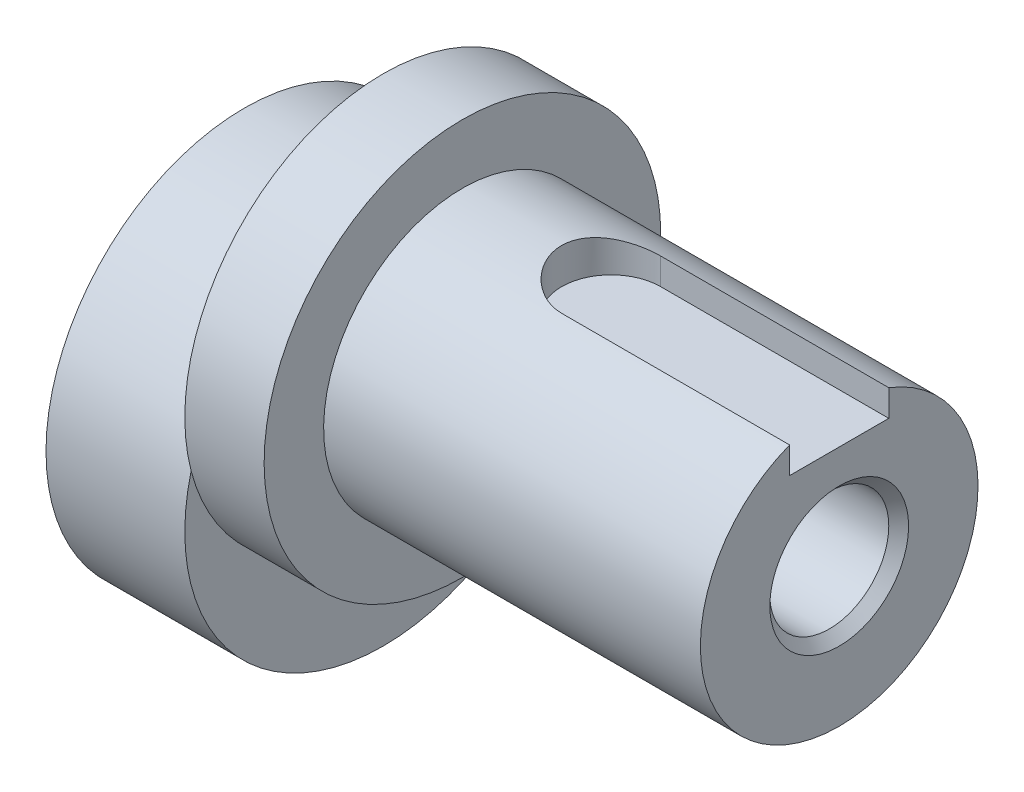
ISO-10303-21;
HEADER;
FILE_DESCRIPTION(('STEP AP214'),'2;1');
FILE_NAME('part.step','',(''),(''),'','','');
FILE_SCHEMA(('AUTOMOTIVE_DESIGN { 1 0 10303 214 1 1 1 1 }'));
ENDSEC;
DATA;
#1=APPLICATION_CONTEXT('core data for automotive mechanical design processes');
#2=APPLICATION_PROTOCOL_DEFINITION('international standard','automotive_design',2000,#1);
#3=PRODUCT_CONTEXT('',#1,'mechanical');
#4=PRODUCT('Part','Part','',(#3));
#5=PRODUCT_RELATED_PRODUCT_CATEGORY('part','',(#4));
#6=PRODUCT_DEFINITION_FORMATION('','',#4);
#7=PRODUCT_DEFINITION_CONTEXT('part definition',#1,'design');
#8=PRODUCT_DEFINITION('design','',#6,#7);
#9=PRODUCT_DEFINITION_SHAPE('','',#8);
#10=(LENGTH_UNIT() NAMED_UNIT(*) SI_UNIT(.MILLI.,.METRE.));
#11=(NAMED_UNIT(*) PLANE_ANGLE_UNIT() SI_UNIT($,.RADIAN.));
#12=(NAMED_UNIT(*) SI_UNIT($,.STERADIAN.) SOLID_ANGLE_UNIT());
#13=UNCERTAINTY_MEASURE_WITH_UNIT(LENGTH_MEASURE(1.E-05),#10,'distance_accuracy_value','');
#14=(GEOMETRIC_REPRESENTATION_CONTEXT(3) GLOBAL_UNCERTAINTY_ASSIGNED_CONTEXT((#13)) GLOBAL_UNIT_ASSIGNED_CONTEXT((#10,
#11,#12)) REPRESENTATION_CONTEXT('',''));
#15=CARTESIAN_POINT('',(0.,0.,0.));
#16=DIRECTION('',(0.,0.,1.));
#17=DIRECTION('',(1.,0.,0.));
#18=AXIS2_PLACEMENT_3D('',#15,#16,#17);
#19=CARTESIAN_POINT('',(30.,5.,0.));
#20=DIRECTION('',(-1.,0.,0.));
#21=DIRECTION('',(0.,0.,1.));
#22=AXIS2_PLACEMENT_3D('',#19,#20,#21);
#23=CYLINDRICAL_SURFACE('',#22,7.);
#24=CARTESIAN_POINT('',(11.,5.,0.));
#25=DIRECTION('',(1.,0.,0.));
#26=DIRECTION('',(0.,0.,-1.));
#27=AXIS2_PLACEMENT_3D('',#24,#25,#26);
#28=CIRCLE('',#27,7.);
#29=CARTESIAN_POINT('',(11.,5.,-7.));
#30=VERTEX_POINT('',#29);
#31=EDGE_CURVE('E112',#30,#30,#28,.T.);
#32=ORIENTED_EDGE('',*,*,#31,.T.);
#33=EDGE_LOOP('',(#32));
#34=FACE_BOUND('',#33,.T.);
#35=DIRECTION('',(-1.,0.,0.));
#36=VECTOR('',#35,1.);
#37=CARTESIAN_POINT('',(30.,11.538348415311,-2.5));
#38=LINE('',#37,#36);
#39=CARTESIAN_POINT('',(30.,11.538348415311,-2.5));
#40=VERTEX_POINT('',#39);
#41=CARTESIAN_POINT('',(18.5,11.538348415311,-2.5));
#42=VERTEX_POINT('',#41);
#43=EDGE_CURVE('E92',#40,#42,#38,.T.);
#44=ORIENTED_EDGE('',*,*,#43,.F.);
#45=CARTESIAN_POINT('',(30.,5.,0.));
#46=DIRECTION('',(1.,0.,0.));
#47=DIRECTION('',(0.,0.,-1.));
#48=AXIS2_PLACEMENT_3D('',#45,#46,#47);
#49=CIRCLE('',#48,7.);
#50=CARTESIAN_POINT('',(30.,11.538348415311,2.5));
#51=VERTEX_POINT('',#50);
#52=EDGE_CURVE('E113',#51,#40,#49,.T.);
#53=ORIENTED_EDGE('',*,*,#52,.F.);
#54=DIRECTION('',(-1.,0.,0.));
#55=VECTOR('',#54,1.);
#56=CARTESIAN_POINT('',(30.,11.538348415311,2.5));
#57=LINE('',#56,#55);
#58=CARTESIAN_POINT('',(18.5,11.538348415311,2.5));
#59=VERTEX_POINT('',#58);
#60=EDGE_CURVE('E96',#59,#51,#57,.F.);
#61=ORIENTED_EDGE('',*,*,#60,.F.);
#62=CARTESIAN_POINT('',(18.5,11.538348415311,-2.5));
#63=CARTESIAN_POINT('',(18.4321107542711,11.5383365378513,-2.50000932220903));
#64=CARTESIAN_POINT('',(18.3642280673609,11.5394054992274,-2.49723485076694));
#65=CARTESIAN_POINT('',(18.2289960893886,11.5436165747813,-2.4861910211816));
#66=CARTESIAN_POINT('',(18.1616466413939,11.5467580541806,-2.47792334551208));
#67=CARTESIAN_POINT('',(18.0281785853972,11.5550121763794,-2.456001752859));
#68=CARTESIAN_POINT('',(17.9620566636602,11.5601183170568,-2.44236559963955));
#69=CARTESIAN_POINT('',(17.8312981648915,11.5721317785417,-2.40985115466648));
#70=CARTESIAN_POINT('',(17.7666616536876,11.5790391790075,-2.39097263107436));
#71=CARTESIAN_POINT('',(17.5757356335225,11.6021493436571,-2.32673964179204));
#72=CARTESIAN_POINT('',(17.4522095478644,11.6207547534084,-2.27375112606986));
#73=CARTESIAN_POINT('',(17.215769666872,11.6622539736071,-2.14910757865425));
#74=CARTESIAN_POINT('',(17.1028636832645,11.6851509042488,-2.07743895048849));
#75=CARTESIAN_POINT('',(16.8857847866473,11.7337991379222,-1.9140257110197));
#76=CARTESIAN_POINT('',(16.7821535248041,11.7596286404137,-1.82158337146744));
#77=CARTESIAN_POINT('',(16.5914912952836,11.8105759232303,-1.6207338877633));
#78=CARTESIAN_POINT('',(16.5044634207566,11.8356935701987,-1.51232377552673));
#79=CARTESIAN_POINT('',(16.346910144545,11.8833113327905,-1.27853915335934));
#80=CARTESIAN_POINT('',(16.2769684781395,11.905708352238,-1.15274833789185));
#81=CARTESIAN_POINT('',(16.1594633532026,11.9444235767263,-0.890250825476634));
#82=CARTESIAN_POINT('',(16.111892220954,11.9607438658547,-0.753547890540327));
#83=CARTESIAN_POINT('',(16.0423593978176,11.9849105051071,-0.478829979256175));
#84=CARTESIAN_POINT('',(16.0194608695289,11.9930659435251,-0.341079835227467));
#85=CARTESIAN_POINT('',(15.9969315972224,12.0010879805382,-0.0634643052969042));
#86=CARTESIAN_POINT('',(15.9972944139654,12.000956873027,0.0764004845074478));
#87=CARTESIAN_POINT('',(16.0207112737611,11.9926225804908,0.347593258486946));
#88=CARTESIAN_POINT('',(16.0427447941985,11.9847824358352,0.479022407078721));
#89=CARTESIAN_POINT('',(16.1071734241588,11.9623783250735,0.736175812143608));
#90=CARTESIAN_POINT('',(16.1495696843625,11.9478139789904,0.861899745780464));
#91=CARTESIAN_POINT('',(16.2540469115653,11.9131650689037,1.10616102429807));
#92=CARTESIAN_POINT('',(16.3163957149601,11.8930059216431,1.22457279066906));
#93=CARTESIAN_POINT('',(16.4587793352234,11.8492335561632,1.44953531305523));
#94=CARTESIAN_POINT('',(16.5388195237836,11.8256192895926,1.5560824517677));
#95=CARTESIAN_POINT('',(16.7193232636567,11.7759054780549,1.7603244525607));
#96=CARTESIAN_POINT('',(16.8206497231449,11.7497405584388,1.85724185700417));
#97=CARTESIAN_POINT('',(17.0383273641656,11.6989034246898,2.03299914621296));
#98=CARTESIAN_POINT('',(17.1546839051685,11.6742317476526,2.11183255456462));
#99=CARTESIAN_POINT('',(17.401942598522,11.628778038754,2.25049860898459));
#100=CARTESIAN_POINT('',(17.5330789755054,11.6080787511899,2.30994207989626));
#101=CARTESIAN_POINT('',(17.8043648015822,11.5738821361027,2.4055543972585));
#102=CARTESIAN_POINT('',(17.944499141169,11.5603730716505,2.44176119399954));
#103=CARTESIAN_POINT('',(18.1550305442642,11.5470854224556,2.47705497148627));
#104=CARTESIAN_POINT('',(18.2237363017718,11.5438201096791,2.48565347586445));
#105=CARTESIAN_POINT('',(18.3616151641917,11.5394491082968,2.49712352174882));
#106=CARTESIAN_POINT('',(18.4307876671005,11.5383410314094,2.50000139665367));
#107=CARTESIAN_POINT('',(18.5,11.538348415311,2.5));
#108=B_SPLINE_CURVE_WITH_KNOTS('',3,(#62,#63,#64,#65,#66,#67,#68,#69,#70,#71,#72,#73,#74,#75,
#76,#77,#78,#79,#80,#81,#82,#83,#84,#85,#86,#87,#88,#89,#90,#91,#92,#93,#94,#95,#96,#97,#98,#99,
#100,#101,#102,#103,#104,#105,#106,#107),.UNSPECIFIED.,.F.,.F.,(4,2,2,2,2,2,2,2,2,2,2,2,2,2,2,2,
2,2,2,2,2,2,4),(0.,0.203591628551585,0.407120929225524,0.609982356545741,0.812852756635989,
1.21793118555512,1.6233052814847,2.0451597231193,2.4670926781184,2.90188398965561,
3.33652604665238,3.75400993940861,4.17137826416922,4.56998920861347,4.96862268086888,
5.37284909448639,5.77719841367921,6.20315837945087,6.62927065674721,7.06347329058505,
7.49696496492444,7.70468580162773,7.91217653896403),.UNSPECIFIED.);
#109=EDGE_CURVE('E11',#42,#59,#108,.T.);
#110=ORIENTED_EDGE('',*,*,#109,.F.);
#111=EDGE_LOOP('',(#44,#53,#61,#110));
#112=FACE_BOUND('',#111,.T.);
#113=ADVANCED_FACE('F33',(#34,#112),#23,.T.);
#114=CARTESIAN_POINT('',(30.,5.,0.));
#115=DIRECTION('',(1.,0.,0.));
#116=DIRECTION('',(0.,0.,-1.));
#117=AXIS2_PLACEMENT_3D('',#114,#115,#116);
#118=PLANE('',#117);
#119=CARTESIAN_POINT('',(30.,5.,0.));
#120=DIRECTION('',(1.,0.,0.));
#121=DIRECTION('',(0.,0.,-1.));
#122=AXIS2_PLACEMENT_3D('',#119,#120,#121);
#123=CIRCLE('',#122,3.50000000000002);
#124=CARTESIAN_POINT('',(30.,5.,-3.50000000000002));
#125=VERTEX_POINT('',#124);
#126=EDGE_CURVE('E136',#125,#125,#123,.F.);
#127=ORIENTED_EDGE('',*,*,#126,.T.);
#128=EDGE_LOOP('',(#127));
#129=FACE_BOUND('',#128,.T.);
#130=ORIENTED_EDGE('',*,*,#52,.T.);
#131=DIRECTION('',(0.,-1.,0.));
#132=VECTOR('',#131,1.);
#133=CARTESIAN_POINT('',(30.,5.,-2.5));
#134=LINE('',#133,#132);
#135=CARTESIAN_POINT('',(30.,10.2,-2.5));
#136=VERTEX_POINT('',#135);
#137=EDGE_CURVE('E46',#40,#136,#134,.T.);
#138=ORIENTED_EDGE('',*,*,#137,.T.);
#139=DIRECTION('',(0.,0.,1.));
#140=VECTOR('',#139,1.);
#141=CARTESIAN_POINT('',(30.,10.2,0.));
#142=LINE('',#141,#140);
#143=CARTESIAN_POINT('',(30.,10.2,2.5));
#144=VERTEX_POINT('',#143);
#145=EDGE_CURVE('E102',#136,#144,#142,.T.);
#146=ORIENTED_EDGE('',*,*,#145,.T.);
#147=DIRECTION('',(0.,1.,0.));
#148=VECTOR('',#147,1.);
#149=CARTESIAN_POINT('',(30.,5.,2.5));
#150=LINE('',#149,#148);
#151=EDGE_CURVE('E143',#144,#51,#150,.T.);
#152=ORIENTED_EDGE('',*,*,#151,.T.);
#153=EDGE_LOOP('',(#130,#138,#146,#152));
#154=FACE_BOUND('',#153,.T.);
#155=ADVANCED_FACE('F146',(#129,#154),#118,.T.);
#156=CARTESIAN_POINT('',(7.,0.,0.));
#157=DIRECTION('',(-1.,0.,0.));
#158=DIRECTION('',(0.,0.,1.));
#159=AXIS2_PLACEMENT_3D('',#156,#157,#158);
#160=CYLINDRICAL_SURFACE('',#159,10.);
#161=CARTESIAN_POINT('',(7.,0.,0.));
#162=DIRECTION('',(1.,0.,0.));
#163=DIRECTION('',(0.,0.,-1.));
#164=AXIS2_PLACEMENT_3D('',#161,#162,#163);
#165=CIRCLE('',#164,10.);
#166=CARTESIAN_POINT('',(7.,2.49999999999999,-9.68245836551854));
#167=VERTEX_POINT('',#166);
#168=CARTESIAN_POINT('',(7.,2.49999999999999,9.68245836551854));
#169=VERTEX_POINT('',#168);
#170=EDGE_CURVE('E124',#167,#169,#165,.T.);
#171=ORIENTED_EDGE('',*,*,#170,.F.);
#172=EDGE_CURVE('E128',#169,#167,#165,.T.);
#173=ORIENTED_EDGE('',*,*,#172,.F.);
#174=EDGE_LOOP('',(#171,#173));
#175=FACE_BOUND('',#174,.T.);
#176=CARTESIAN_POINT('',(0.,0.,0.));
#177=DIRECTION('',(1.,0.,0.));
#178=DIRECTION('',(0.,0.,-1.));
#179=AXIS2_PLACEMENT_3D('',#176,#177,#178);
#180=CIRCLE('',#179,10.);
#181=CARTESIAN_POINT('',(0.,0.,-10.));
#182=VERTEX_POINT('',#181);
#183=EDGE_CURVE('E122',#182,#182,#180,.T.);
#184=ORIENTED_EDGE('',*,*,#183,.T.);
#185=EDGE_LOOP('',(#184));
#186=FACE_BOUND('',#185,.T.);
#187=ADVANCED_FACE('F165',(#175,#186),#160,.T.);
#188=CARTESIAN_POINT('',(7.,0.,0.));
#189=DIRECTION('',(1.,0.,0.));
#190=DIRECTION('',(0.,0.,-1.));
#191=AXIS2_PLACEMENT_3D('',#188,#189,#190);
#192=PLANE('',#191);
#193=CARTESIAN_POINT('',(7.,5.,0.));
#194=DIRECTION('',(1.,0.,0.));
#195=DIRECTION('',(0.,0.,-1.));
#196=AXIS2_PLACEMENT_3D('',#193,#194,#195);
#197=CIRCLE('',#196,10.);
#198=EDGE_CURVE('E60',#169,#167,#197,.T.);
#199=ORIENTED_EDGE('',*,*,#198,.F.);
#200=ORIENTED_EDGE('',*,*,#172,.T.);
#201=EDGE_LOOP('',(#199,#200));
#202=FACE_BOUND('',#201,.T.);
#203=ADVANCED_FACE('F185',(#202),#192,.T.);
#204=CARTESIAN_POINT('',(0.,0.,0.));
#205=DIRECTION('',(1.,0.,0.));
#206=DIRECTION('',(0.,0.,-1.));
#207=AXIS2_PLACEMENT_3D('',#204,#205,#206);
#208=PLANE('',#207);
#209=CARTESIAN_POINT('',(0.,5.,0.));
#210=DIRECTION('',(1.,0.,0.));
#211=DIRECTION('',(0.,0.,-1.));
#212=AXIS2_PLACEMENT_3D('',#209,#210,#211);
#213=CIRCLE('',#212,3.5);
#214=CARTESIAN_POINT('',(0.,5.,-3.5));
#215=VERTEX_POINT('',#214);
#216=EDGE_CURVE('E139',#215,#215,#213,.T.);
#217=ORIENTED_EDGE('',*,*,#216,.T.);
#218=EDGE_LOOP('',(#217));
#219=FACE_BOUND('',#218,.T.);
#220=ORIENTED_EDGE('',*,*,#183,.F.);
#221=EDGE_LOOP('',(#220));
#222=FACE_BOUND('',#221,.T.);
#223=ADVANCED_FACE('F180',(#219,#222),#208,.F.);
#224=CARTESIAN_POINT('',(7.,5.,0.));
#225=DIRECTION('',(1.,0.,0.));
#226=DIRECTION('',(0.,0.,-1.));
#227=AXIS2_PLACEMENT_3D('',#224,#225,#226);
#228=PLANE('',#227);
#229=EDGE_CURVE('E116',#167,#169,#197,.T.);
#230=ORIENTED_EDGE('',*,*,#229,.F.);
#231=ORIENTED_EDGE('',*,*,#170,.T.);
#232=EDGE_LOOP('',(#230,#231));
#233=FACE_BOUND('',#232,.T.);
#234=ADVANCED_FACE('F177',(#233),#228,.F.);
#235=CARTESIAN_POINT('',(11.,5.,0.));
#236=DIRECTION('',(-1.,0.,0.));
#237=DIRECTION('',(0.,0.,1.));
#238=AXIS2_PLACEMENT_3D('',#235,#236,#237);
#239=CYLINDRICAL_SURFACE('',#238,10.);
#240=CARTESIAN_POINT('',(11.,5.,0.));
#241=DIRECTION('',(1.,0.,0.));
#242=DIRECTION('',(0.,0.,-1.));
#243=AXIS2_PLACEMENT_3D('',#240,#241,#242);
#244=CIRCLE('',#243,10.);
#245=CARTESIAN_POINT('',(11.,5.,-10.));
#246=VERTEX_POINT('',#245);
#247=EDGE_CURVE('E119',#246,#246,#244,.T.);
#248=ORIENTED_EDGE('',*,*,#247,.F.);
#249=EDGE_LOOP('',(#248));
#250=FACE_BOUND('',#249,.T.);
#251=ORIENTED_EDGE('',*,*,#198,.T.);
#252=ORIENTED_EDGE('',*,*,#229,.T.);
#253=EDGE_LOOP('',(#251,#252));
#254=FACE_BOUND('',#253,.T.);
#255=ADVANCED_FACE('F175',(#250,#254),#239,.T.);
#256=CARTESIAN_POINT('',(11.,5.,0.));
#257=DIRECTION('',(1.,0.,0.));
#258=DIRECTION('',(0.,0.,-1.));
#259=AXIS2_PLACEMENT_3D('',#256,#257,#258);
#260=PLANE('',#259);
#261=ORIENTED_EDGE('',*,*,#31,.F.);
#262=EDGE_LOOP('',(#261));
#263=FACE_BOUND('',#262,.T.);
#264=ORIENTED_EDGE('',*,*,#247,.T.);
#265=EDGE_LOOP('',(#264));
#266=FACE_BOUND('',#265,.T.);
#267=ADVANCED_FACE('F171',(#263,#266),#260,.T.);
#268=CARTESIAN_POINT('',(0.,5.,0.));
#269=DIRECTION('',(1.,0.,0.));
#270=DIRECTION('',(0.,0.,-1.));
#271=AXIS2_PLACEMENT_3D('',#268,#269,#270);
#272=CYLINDRICAL_SURFACE('',#271,3.);
#273=CARTESIAN_POINT('',(29.5,5.,0.));
#274=DIRECTION('',(1.,0.,0.));
#275=DIRECTION('',(0.,0.,-1.));
#276=AXIS2_PLACEMENT_3D('',#273,#274,#275);
#277=CIRCLE('',#276,3.);
#278=CARTESIAN_POINT('',(29.5,5.,-3.));
#279=VERTEX_POINT('',#278);
#280=EDGE_CURVE('E133',#279,#279,#277,.T.);
#281=ORIENTED_EDGE('',*,*,#280,.T.);
#282=EDGE_LOOP('',(#281));
#283=FACE_BOUND('',#282,.T.);
#284=CARTESIAN_POINT('',(0.500000000000003,5.,0.));
#285=DIRECTION('',(1.,0.,0.));
#286=DIRECTION('',(0.,0.,-1.));
#287=AXIS2_PLACEMENT_3D('',#284,#285,#286);
#288=CIRCLE('',#287,3.);
#289=CARTESIAN_POINT('',(0.500000000000003,5.,-3.));
#290=VERTEX_POINT('',#289);
#291=EDGE_CURVE('E127',#290,#290,#288,.F.);
#292=ORIENTED_EDGE('',*,*,#291,.T.);
#293=EDGE_LOOP('',(#292));
#294=FACE_BOUND('',#293,.T.);
#295=ADVANCED_FACE('F174',(#283,#294),#272,.F.);
#296=CARTESIAN_POINT('',(29.5,5.,0.));
#297=DIRECTION('',(1.,0.,0.));
#298=DIRECTION('',(0.,0.,-1.));
#299=AXIS2_PLACEMENT_3D('',#296,#297,#298);
#300=CONICAL_SURFACE('',#299,3.,0.785398163397451);
#301=ORIENTED_EDGE('',*,*,#126,.F.);
#302=EDGE_LOOP('',(#301));
#303=FACE_BOUND('',#302,.T.);
#304=ORIENTED_EDGE('',*,*,#280,.F.);
#305=EDGE_LOOP('',(#304));
#306=FACE_BOUND('',#305,.T.);
#307=ADVANCED_FACE('F193',(#303,#306),#300,.F.);
#308=CARTESIAN_POINT('',(0.,5.,0.));
#309=DIRECTION('',(-1.,0.,0.));
#310=DIRECTION('',(0.,0.,1.));
#311=AXIS2_PLACEMENT_3D('',#308,#309,#310);
#312=CONICAL_SURFACE('',#311,3.5,0.785398163397445);
#313=ORIENTED_EDGE('',*,*,#291,.F.);
#314=EDGE_LOOP('',(#313));
#315=FACE_BOUND('',#314,.T.);
#316=ORIENTED_EDGE('',*,*,#216,.F.);
#317=EDGE_LOOP('',(#316));
#318=FACE_BOUND('',#317,.T.);
#319=ADVANCED_FACE('F35',(#315,#318),#312,.F.);
#320=CARTESIAN_POINT('',(18.5,29.2,0.));
#321=DIRECTION('',(0.,-1.,0.));
#322=DIRECTION('',(0.,0.,-1.));
#323=AXIS2_PLACEMENT_3D('',#320,#321,#322);
#324=CYLINDRICAL_SURFACE('',#323,2.5);
#325=ORIENTED_EDGE('',*,*,#109,.T.);
#326=DIRECTION('',(0.,-1.,0.));
#327=VECTOR('',#326,1.);
#328=CARTESIAN_POINT('',(18.5,29.2,2.5));
#329=LINE('',#328,#327);
#330=CARTESIAN_POINT('',(18.5,10.2,2.5));
#331=VERTEX_POINT('',#330);
#332=EDGE_CURVE('E97',#59,#331,#329,.T.);
#333=ORIENTED_EDGE('',*,*,#332,.T.);
#334=CARTESIAN_POINT('',(18.5,10.2,0.));
#335=DIRECTION('',(0.,1.,0.));
#336=DIRECTION('',(0.,0.,1.));
#337=AXIS2_PLACEMENT_3D('',#334,#335,#336);
#338=CIRCLE('',#337,2.5);
#339=CARTESIAN_POINT('',(18.5,10.2,-2.5));
#340=VERTEX_POINT('',#339);
#341=EDGE_CURVE('E100',#340,#331,#338,.T.);
#342=ORIENTED_EDGE('',*,*,#341,.F.);
#343=DIRECTION('',(0.,-1.,0.));
#344=VECTOR('',#343,1.);
#345=CARTESIAN_POINT('',(18.5,29.2,-2.5));
#346=LINE('',#345,#344);
#347=EDGE_CURVE('E86',#42,#340,#346,.T.);
#348=ORIENTED_EDGE('',*,*,#347,.F.);
#349=EDGE_LOOP('',(#325,#333,#342,#348));
#350=FACE_BOUND('',#349,.T.);
#351=ADVANCED_FACE('F104',(#350),#324,.F.);
#352=CARTESIAN_POINT('',(32.7907884371398,29.2,-2.5));
#353=DIRECTION('',(0.,0.,1.));
#354=DIRECTION('',(1.,0.,0.));
#355=AXIS2_PLACEMENT_3D('',#352,#353,#354);
#356=PLANE('',#355);
#357=ORIENTED_EDGE('',*,*,#43,.T.);
#358=ORIENTED_EDGE('',*,*,#347,.T.);
#359=DIRECTION('',(-1.,0.,0.));
#360=VECTOR('',#359,1.);
#361=CARTESIAN_POINT('',(32.7907884371398,10.2,-2.5));
#362=LINE('',#361,#360);
#363=EDGE_CURVE('E89',#136,#340,#362,.T.);
#364=ORIENTED_EDGE('',*,*,#363,.F.);
#365=ORIENTED_EDGE('',*,*,#137,.F.);
#366=EDGE_LOOP('',(#357,#358,#364,#365));
#367=FACE_BOUND('',#366,.T.);
#368=ADVANCED_FACE('F88',(#367),#356,.T.);
#369=CARTESIAN_POINT('',(32.7907884371398,29.2,2.5));
#370=DIRECTION('',(0.,0.,-1.));
#371=DIRECTION('',(-1.,0.,0.));
#372=AXIS2_PLACEMENT_3D('',#369,#370,#371);
#373=PLANE('',#372);
#374=ORIENTED_EDGE('',*,*,#60,.T.);
#375=ORIENTED_EDGE('',*,*,#151,.F.);
#376=DIRECTION('',(1.,0.,0.));
#377=VECTOR('',#376,1.);
#378=CARTESIAN_POINT('',(32.7907884371398,10.2,2.5));
#379=LINE('',#378,#377);
#380=EDGE_CURVE('E53',#331,#144,#379,.T.);
#381=ORIENTED_EDGE('',*,*,#380,.F.);
#382=ORIENTED_EDGE('',*,*,#332,.F.);
#383=EDGE_LOOP('',(#374,#375,#381,#382));
#384=FACE_BOUND('',#383,.T.);
#385=ADVANCED_FACE('F151',(#384),#373,.T.);
#386=CARTESIAN_POINT('',(18.5,10.2,0.));
#387=DIRECTION('',(0.,1.,0.));
#388=DIRECTION('',(0.,0.,1.));
#389=AXIS2_PLACEMENT_3D('',#386,#387,#388);
#390=PLANE('',#389);
#391=ORIENTED_EDGE('',*,*,#363,.T.);
#392=ORIENTED_EDGE('',*,*,#341,.T.);
#393=ORIENTED_EDGE('',*,*,#380,.T.);
#394=ORIENTED_EDGE('',*,*,#145,.F.);
#395=EDGE_LOOP('',(#391,#392,#393,#394));
#396=FACE_BOUND('',#395,.T.);
#397=ADVANCED_FACE('F99',(#396),#390,.T.);
#398=CLOSED_SHELL('',(#113,#155,#187,#203,#223,#234,#255,#267,#295,#307,#319,#351,#368,#385,#397));
#399=MANIFOLD_SOLID_BREP('B2',#398);
#400=ADVANCED_BREP_SHAPE_REPRESENTATION('',(#18,#399),#14);
#401=SHAPE_DEFINITION_REPRESENTATION(#9,#400);
ENDSEC;
END-ISO-10303-21;
